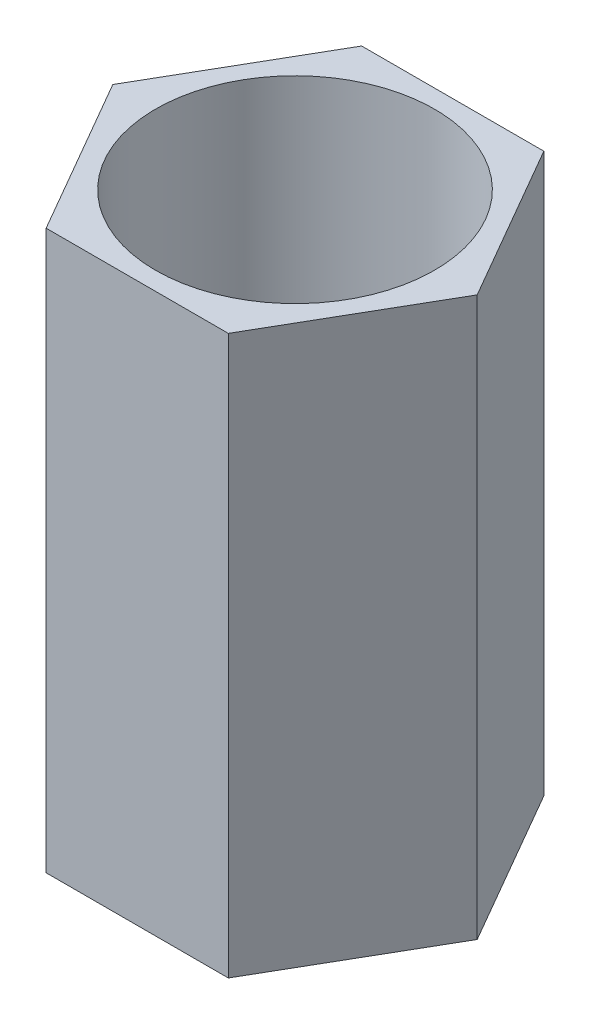
ISO-10303-21;
HEADER;
FILE_DESCRIPTION(('STEP AP214'),'2;1');
FILE_NAME('part.step','',(''),(''),'','','');
FILE_SCHEMA(('AUTOMOTIVE_DESIGN { 1 0 10303 214 1 1 1 1 }'));
ENDSEC;
DATA;
#1=APPLICATION_CONTEXT('core data for automotive mechanical design processes');
#2=APPLICATION_PROTOCOL_DEFINITION('international standard','automotive_design',2000,#1);
#3=PRODUCT_CONTEXT('',#1,'mechanical');
#4=PRODUCT('Part','Part','',(#3));
#5=PRODUCT_RELATED_PRODUCT_CATEGORY('part','',(#4));
#6=PRODUCT_DEFINITION_FORMATION('','',#4);
#7=PRODUCT_DEFINITION_CONTEXT('part definition',#1,'design');
#8=PRODUCT_DEFINITION('design','',#6,#7);
#9=PRODUCT_DEFINITION_SHAPE('','',#8);
#10=(LENGTH_UNIT() NAMED_UNIT(*) SI_UNIT(.MILLI.,.METRE.));
#11=(NAMED_UNIT(*) PLANE_ANGLE_UNIT() SI_UNIT($,.RADIAN.));
#12=(NAMED_UNIT(*) SI_UNIT($,.STERADIAN.) SOLID_ANGLE_UNIT());
#13=UNCERTAINTY_MEASURE_WITH_UNIT(LENGTH_MEASURE(1.E-05),#10,'distance_accuracy_value','');
#14=(GEOMETRIC_REPRESENTATION_CONTEXT(3) GLOBAL_UNCERTAINTY_ASSIGNED_CONTEXT((#13)) GLOBAL_UNIT_ASSIGNED_CONTEXT((#10,
#11,#12)) REPRESENTATION_CONTEXT('',''));
#15=CARTESIAN_POINT('',(0.,0.,0.));
#16=DIRECTION('',(0.,0.,1.));
#17=DIRECTION('',(1.,0.,0.));
#18=AXIS2_PLACEMENT_3D('',#15,#16,#17);
#19=CARTESIAN_POINT('',(0.,6.,0.));
#20=DIRECTION('',(0.,1.,0.));
#21=DIRECTION('',(0.,0.,1.));
#22=AXIS2_PLACEMENT_3D('',#19,#20,#21);
#23=PLANE('',#22);
#24=DIRECTION('',(1.,0.,0.));
#25=VECTOR('',#24,1.);
#26=CARTESIAN_POINT('',(-0.979018569486717,6.,1.6957099039044));
#27=LINE('',#26,#25);
#28=CARTESIAN_POINT('',(-0.979018569486717,6.,1.6957099039044));
#29=VERTEX_POINT('',#28);
#30=CARTESIAN_POINT('',(0.979018569486719,6.,1.6957099039044));
#31=VERTEX_POINT('',#30);
#32=EDGE_CURVE('E129',#29,#31,#27,.T.);
#33=ORIENTED_EDGE('',*,*,#32,.T.);
#34=DIRECTION('',(0.5,0.,-0.866025403784439));
#35=VECTOR('',#34,1.);
#36=CARTESIAN_POINT('',(0.979018569486719,6.,1.6957099039044));
#37=LINE('',#36,#35);
#38=CARTESIAN_POINT('',(1.95803713897344,6.,0.));
#39=VERTEX_POINT('',#38);
#40=EDGE_CURVE('E87',#31,#39,#37,.T.);
#41=ORIENTED_EDGE('',*,*,#40,.T.);
#42=DIRECTION('',(-0.5,0.,-0.866025403784438));
#43=VECTOR('',#42,1.);
#44=CARTESIAN_POINT('',(1.95803713897344,6.,0.));
#45=LINE('',#44,#43);
#46=CARTESIAN_POINT('',(0.979018569486718,6.,-1.6957099039044));
#47=VERTEX_POINT('',#46);
#48=EDGE_CURVE('E100',#39,#47,#45,.T.);
#49=ORIENTED_EDGE('',*,*,#48,.T.);
#50=DIRECTION('',(-1.,0.,0.));
#51=VECTOR('',#50,1.);
#52=CARTESIAN_POINT('',(0.979018569486718,6.,-1.6957099039044));
#53=LINE('',#52,#51);
#54=CARTESIAN_POINT('',(-0.979018569486718,6.,-1.6957099039044));
#55=VERTEX_POINT('',#54);
#56=EDGE_CURVE('E94',#47,#55,#53,.T.);
#57=ORIENTED_EDGE('',*,*,#56,.T.);
#58=DIRECTION('',(-0.5,0.,0.866025403784439));
#59=VECTOR('',#58,1.);
#60=CARTESIAN_POINT('',(-0.979018569486718,6.,-1.6957099039044));
#61=LINE('',#60,#59);
#62=CARTESIAN_POINT('',(-1.95803713897344,6.,0.));
#63=VERTEX_POINT('',#62);
#64=EDGE_CURVE('E98',#55,#63,#61,.T.);
#65=ORIENTED_EDGE('',*,*,#64,.T.);
#66=DIRECTION('',(0.5,0.,0.866025403784438));
#67=VECTOR('',#66,1.);
#68=CARTESIAN_POINT('',(-1.95803713897344,6.,0.));
#69=LINE('',#68,#67);
#70=EDGE_CURVE('E50',#63,#29,#69,.T.);
#71=ORIENTED_EDGE('',*,*,#70,.T.);
#72=EDGE_LOOP('',(#33,#41,#49,#57,#65,#71));
#73=FACE_BOUND('',#72,.T.);
#74=CARTESIAN_POINT('',(0.,6.,0.));
#75=DIRECTION('',(0.,1.,0.));
#76=DIRECTION('',(0.,0.,1.));
#77=AXIS2_PLACEMENT_3D('',#74,#75,#76);
#78=CIRCLE('',#77,1.5);
#79=CARTESIAN_POINT('',(0.,6.,1.5));
#80=VERTEX_POINT('',#79);
#81=EDGE_CURVE('E122',#80,#80,#78,.T.);
#82=ORIENTED_EDGE('',*,*,#81,.F.);
#83=EDGE_LOOP('',(#82));
#84=FACE_BOUND('',#83,.T.);
#85=ADVANCED_FACE('F33',(#73,#84),#23,.T.);
#86=CARTESIAN_POINT('',(0.,0.,0.));
#87=DIRECTION('',(0.,1.,0.));
#88=DIRECTION('',(0.,0.,1.));
#89=AXIS2_PLACEMENT_3D('',#86,#87,#88);
#90=PLANE('',#89);
#91=DIRECTION('',(1.,0.,0.));
#92=VECTOR('',#91,1.);
#93=CARTESIAN_POINT('',(-0.979018569486717,0.,1.6957099039044));
#94=LINE('',#93,#92);
#95=CARTESIAN_POINT('',(-0.979018569486717,0.,1.6957099039044));
#96=VERTEX_POINT('',#95);
#97=CARTESIAN_POINT('',(0.979018569486719,0.,1.6957099039044));
#98=VERTEX_POINT('',#97);
#99=EDGE_CURVE('E118',#96,#98,#94,.T.);
#100=ORIENTED_EDGE('',*,*,#99,.F.);
#101=DIRECTION('',(0.5,0.,0.866025403784438));
#102=VECTOR('',#101,1.);
#103=CARTESIAN_POINT('',(-1.95803713897344,0.,0.));
#104=LINE('',#103,#102);
#105=CARTESIAN_POINT('',(-1.95803713897344,0.,0.));
#106=VERTEX_POINT('',#105);
#107=EDGE_CURVE('E79',#106,#96,#104,.T.);
#108=ORIENTED_EDGE('',*,*,#107,.F.);
#109=DIRECTION('',(-0.5,0.,0.866025403784439));
#110=VECTOR('',#109,1.);
#111=CARTESIAN_POINT('',(-0.979018569486718,0.,-1.6957099039044));
#112=LINE('',#111,#110);
#113=CARTESIAN_POINT('',(-0.979018569486718,0.,-1.6957099039044));
#114=VERTEX_POINT('',#113);
#115=EDGE_CURVE('E73',#114,#106,#112,.T.);
#116=ORIENTED_EDGE('',*,*,#115,.F.);
#117=DIRECTION('',(-1.,0.,0.));
#118=VECTOR('',#117,1.);
#119=CARTESIAN_POINT('',(0.979018569486718,0.,-1.6957099039044));
#120=LINE('',#119,#118);
#121=CARTESIAN_POINT('',(0.979018569486718,0.,-1.6957099039044));
#122=VERTEX_POINT('',#121);
#123=EDGE_CURVE('E108',#122,#114,#120,.T.);
#124=ORIENTED_EDGE('',*,*,#123,.F.);
#125=DIRECTION('',(-0.5,0.,-0.866025403784438));
#126=VECTOR('',#125,1.);
#127=CARTESIAN_POINT('',(1.95803713897344,0.,0.));
#128=LINE('',#127,#126);
#129=CARTESIAN_POINT('',(1.95803713897344,0.,0.));
#130=VERTEX_POINT('',#129);
#131=EDGE_CURVE('E124',#130,#122,#128,.T.);
#132=ORIENTED_EDGE('',*,*,#131,.F.);
#133=DIRECTION('',(0.5,0.,-0.866025403784439));
#134=VECTOR('',#133,1.);
#135=CARTESIAN_POINT('',(0.979018569486719,0.,1.6957099039044));
#136=LINE('',#135,#134);
#137=EDGE_CURVE('E121',#98,#130,#136,.T.);
#138=ORIENTED_EDGE('',*,*,#137,.F.);
#139=EDGE_LOOP('',(#100,#108,#116,#124,#132,#138));
#140=FACE_BOUND('',#139,.T.);
#141=CARTESIAN_POINT('',(0.,0.,0.));
#142=DIRECTION('',(0.,1.,0.));
#143=DIRECTION('',(0.,0.,1.));
#144=AXIS2_PLACEMENT_3D('',#141,#142,#143);
#145=CIRCLE('',#144,1.5);
#146=CARTESIAN_POINT('',(0.,0.,1.5));
#147=VERTEX_POINT('',#146);
#148=EDGE_CURVE('E222',#147,#147,#145,.T.);
#149=ORIENTED_EDGE('',*,*,#148,.T.);
#150=EDGE_LOOP('',(#149));
#151=FACE_BOUND('',#150,.T.);
#152=ADVANCED_FACE('F138',(#140,#151),#90,.F.);
#153=CARTESIAN_POINT('',(-0.979018569486717,6.,1.6957099039044));
#154=DIRECTION('',(0.,0.,-1.));
#155=DIRECTION('',(-1.,0.,0.));
#156=AXIS2_PLACEMENT_3D('',#153,#154,#155);
#157=PLANE('',#156);
#158=ORIENTED_EDGE('',*,*,#99,.T.);
#159=DIRECTION('',(0.,-1.,0.));
#160=VECTOR('',#159,1.);
#161=CARTESIAN_POINT('',(0.979018569486719,6.,1.6957099039044));
#162=LINE('',#161,#160);
#163=EDGE_CURVE('E11',#31,#98,#162,.T.);
#164=ORIENTED_EDGE('',*,*,#163,.F.);
#165=ORIENTED_EDGE('',*,*,#32,.F.);
#166=DIRECTION('',(0.,-1.,0.));
#167=VECTOR('',#166,1.);
#168=CARTESIAN_POINT('',(-0.979018569486717,6.,1.6957099039044));
#169=LINE('',#168,#167);
#170=EDGE_CURVE('E114',#29,#96,#169,.T.);
#171=ORIENTED_EDGE('',*,*,#170,.T.);
#172=EDGE_LOOP('',(#158,#164,#165,#171));
#173=FACE_BOUND('',#172,.T.);
#174=ADVANCED_FACE('F35',(#173),#157,.F.);
#175=CARTESIAN_POINT('',(0.979018569486719,6.,1.6957099039044));
#176=DIRECTION('',(-0.866025403784439,0.,-0.5));
#177=DIRECTION('',(-0.5,0.,0.866025403784439));
#178=AXIS2_PLACEMENT_3D('',#175,#176,#177);
#179=PLANE('',#178);
#180=ORIENTED_EDGE('',*,*,#137,.T.);
#181=DIRECTION('',(0.,-1.,0.));
#182=VECTOR('',#181,1.);
#183=CARTESIAN_POINT('',(1.95803713897344,6.,0.));
#184=LINE('',#183,#182);
#185=EDGE_CURVE('E42',#39,#130,#184,.T.);
#186=ORIENTED_EDGE('',*,*,#185,.F.);
#187=ORIENTED_EDGE('',*,*,#40,.F.);
#188=ORIENTED_EDGE('',*,*,#163,.T.);
#189=EDGE_LOOP('',(#180,#186,#187,#188));
#190=FACE_BOUND('',#189,.T.);
#191=ADVANCED_FACE('F163',(#190),#179,.F.);
#192=CARTESIAN_POINT('',(1.95803713897344,6.,0.));
#193=DIRECTION('',(-0.866025403784439,0.,0.5));
#194=DIRECTION('',(0.5,0.,0.866025403784439));
#195=AXIS2_PLACEMENT_3D('',#192,#193,#194);
#196=PLANE('',#195);
#197=ORIENTED_EDGE('',*,*,#131,.T.);
#198=DIRECTION('',(0.,-1.,0.));
#199=VECTOR('',#198,1.);
#200=CARTESIAN_POINT('',(0.979018569486718,6.,-1.6957099039044));
#201=LINE('',#200,#199);
#202=EDGE_CURVE('E109',#47,#122,#201,.T.);
#203=ORIENTED_EDGE('',*,*,#202,.F.);
#204=ORIENTED_EDGE('',*,*,#48,.F.);
#205=ORIENTED_EDGE('',*,*,#185,.T.);
#206=EDGE_LOOP('',(#197,#203,#204,#205));
#207=FACE_BOUND('',#206,.T.);
#208=ADVANCED_FACE('F135',(#207),#196,.F.);
#209=CARTESIAN_POINT('',(0.979018569486718,6.,-1.6957099039044));
#210=DIRECTION('',(0.,0.,1.));
#211=DIRECTION('',(1.,0.,0.));
#212=AXIS2_PLACEMENT_3D('',#209,#210,#211);
#213=PLANE('',#212);
#214=ORIENTED_EDGE('',*,*,#123,.T.);
#215=DIRECTION('',(0.,-1.,0.));
#216=VECTOR('',#215,1.);
#217=CARTESIAN_POINT('',(-0.979018569486718,6.,-1.6957099039044));
#218=LINE('',#217,#216);
#219=EDGE_CURVE('E105',#55,#114,#218,.T.);
#220=ORIENTED_EDGE('',*,*,#219,.F.);
#221=ORIENTED_EDGE('',*,*,#56,.F.);
#222=ORIENTED_EDGE('',*,*,#202,.T.);
#223=EDGE_LOOP('',(#214,#220,#221,#222));
#224=FACE_BOUND('',#223,.T.);
#225=ADVANCED_FACE('F106',(#224),#213,.F.);
#226=CARTESIAN_POINT('',(-0.979018569486718,6.,-1.6957099039044));
#227=DIRECTION('',(0.866025403784439,0.,0.5));
#228=DIRECTION('',(0.5,0.,-0.866025403784439));
#229=AXIS2_PLACEMENT_3D('',#226,#227,#228);
#230=PLANE('',#229);
#231=ORIENTED_EDGE('',*,*,#115,.T.);
#232=DIRECTION('',(0.,-1.,0.));
#233=VECTOR('',#232,1.);
#234=CARTESIAN_POINT('',(-1.95803713897344,6.,0.));
#235=LINE('',#234,#233);
#236=EDGE_CURVE('E110',#63,#106,#235,.T.);
#237=ORIENTED_EDGE('',*,*,#236,.F.);
#238=ORIENTED_EDGE('',*,*,#64,.F.);
#239=ORIENTED_EDGE('',*,*,#219,.T.);
#240=EDGE_LOOP('',(#231,#237,#238,#239));
#241=FACE_BOUND('',#240,.T.);
#242=ADVANCED_FACE('F112',(#241),#230,.F.);
#243=CARTESIAN_POINT('',(-1.95803713897344,6.,0.));
#244=DIRECTION('',(0.866025403784438,0.,-0.5));
#245=DIRECTION('',(-0.5,0.,-0.866025403784438));
#246=AXIS2_PLACEMENT_3D('',#243,#244,#245);
#247=PLANE('',#246);
#248=ORIENTED_EDGE('',*,*,#107,.T.);
#249=ORIENTED_EDGE('',*,*,#170,.F.);
#250=ORIENTED_EDGE('',*,*,#70,.F.);
#251=ORIENTED_EDGE('',*,*,#236,.T.);
#252=EDGE_LOOP('',(#248,#249,#250,#251));
#253=FACE_BOUND('',#252,.T.);
#254=ADVANCED_FACE('F143',(#253),#247,.F.);
#255=CARTESIAN_POINT('',(0.,6.,0.));
#256=DIRECTION('',(0.,-1.,0.));
#257=DIRECTION('',(0.,0.,-1.));
#258=AXIS2_PLACEMENT_3D('',#255,#256,#257);
#259=CYLINDRICAL_SURFACE('',#258,1.5);
#260=ORIENTED_EDGE('',*,*,#81,.T.);
#261=EDGE_LOOP('',(#260));
#262=FACE_BOUND('',#261,.T.);
#263=ORIENTED_EDGE('',*,*,#148,.F.);
#264=EDGE_LOOP('',(#263));
#265=FACE_BOUND('',#264,.T.);
#266=ADVANCED_FACE('F145',(#262,#265),#259,.F.);
#267=CLOSED_SHELL('',(#85,#152,#174,#191,#208,#225,#242,#254,#266));
#268=MANIFOLD_SOLID_BREP('B2',#267);
#269=ADVANCED_BREP_SHAPE_REPRESENTATION('',(#18,#268),#14);
#270=SHAPE_DEFINITION_REPRESENTATION(#9,#269);
ENDSEC;
END-ISO-10303-21;
